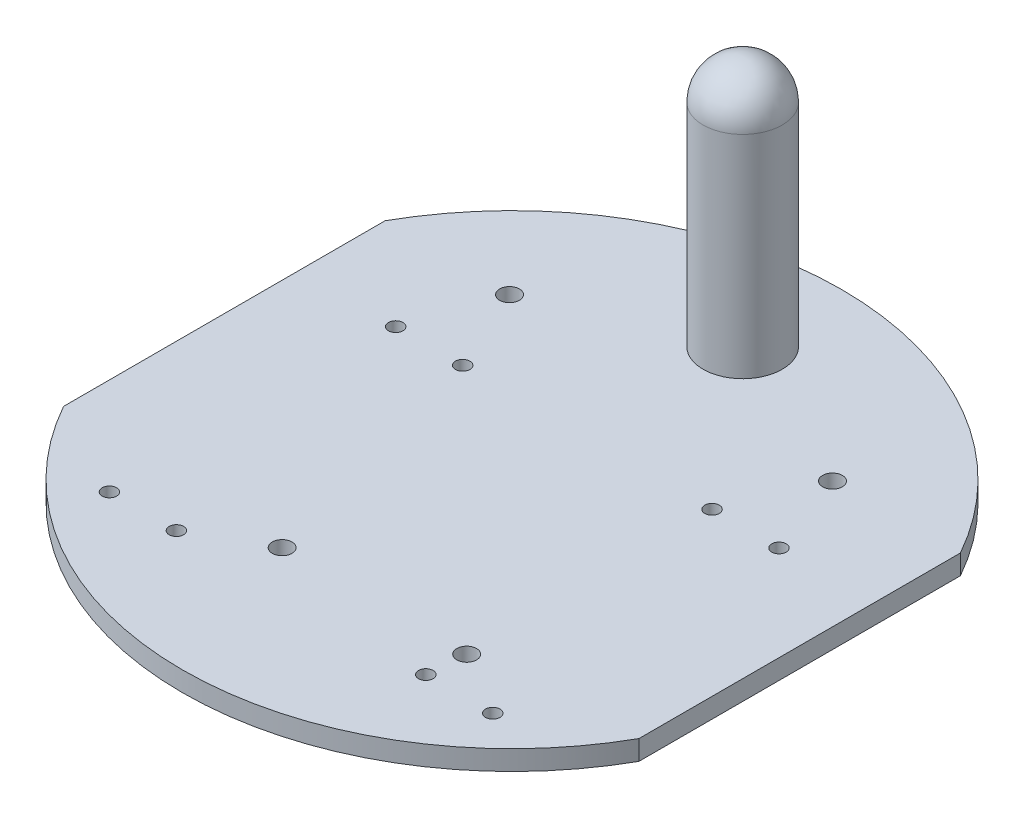
ISO-10303-21;
HEADER;
FILE_DESCRIPTION(('STEP AP214'),'2;1');
FILE_NAME('part.step','',(''),(''),'','','');
FILE_SCHEMA(('AUTOMOTIVE_DESIGN { 1 0 10303 214 1 1 1 1 }'));
ENDSEC;
DATA;
#1=APPLICATION_CONTEXT('core data for automotive mechanical design processes');
#2=APPLICATION_PROTOCOL_DEFINITION('international standard','automotive_design',2000,#1);
#3=PRODUCT_CONTEXT('',#1,'mechanical');
#4=PRODUCT('Part','Part','',(#3));
#5=PRODUCT_RELATED_PRODUCT_CATEGORY('part','',(#4));
#6=PRODUCT_DEFINITION_FORMATION('','',#4);
#7=PRODUCT_DEFINITION_CONTEXT('part definition',#1,'design');
#8=PRODUCT_DEFINITION('design','',#6,#7);
#9=PRODUCT_DEFINITION_SHAPE('','',#8);
#10=(LENGTH_UNIT() NAMED_UNIT(*) SI_UNIT(.MILLI.,.METRE.));
#11=(NAMED_UNIT(*) PLANE_ANGLE_UNIT() SI_UNIT($,.RADIAN.));
#12=(NAMED_UNIT(*) SI_UNIT($,.STERADIAN.) SOLID_ANGLE_UNIT());
#13=UNCERTAINTY_MEASURE_WITH_UNIT(LENGTH_MEASURE(1.E-05),#10,'distance_accuracy_value','');
#14=(GEOMETRIC_REPRESENTATION_CONTEXT(3) GLOBAL_UNCERTAINTY_ASSIGNED_CONTEXT((#13)) GLOBAL_UNIT_ASSIGNED_CONTEXT((#10,
#11,#12)) REPRESENTATION_CONTEXT('',''));
#15=CARTESIAN_POINT('',(0.,0.,0.));
#16=DIRECTION('',(0.,0.,1.));
#17=DIRECTION('',(1.,0.,0.));
#18=AXIS2_PLACEMENT_3D('',#15,#16,#17);
#19=CARTESIAN_POINT('',(0.,3.,0.));
#20=DIRECTION('',(0.,-1.,0.));
#21=DIRECTION('',(0.,0.,-1.));
#22=AXIS2_PLACEMENT_3D('',#19,#20,#21);
#23=CYLINDRICAL_SURFACE('',#22,50.);
#24=CARTESIAN_POINT('',(0.,0.,0.));
#25=DIRECTION('',(0.,1.,0.));
#26=DIRECTION('',(0.,0.,1.));
#27=AXIS2_PLACEMENT_3D('',#24,#25,#26);
#28=CIRCLE('',#27,50.);
#29=CARTESIAN_POINT('',(43.65,0.,-24.3860103337959));
#30=VERTEX_POINT('',#29);
#31=CARTESIAN_POINT('',(-43.65,0.,-24.3860103337959));
#32=VERTEX_POINT('',#31);
#33=EDGE_CURVE('E93',#30,#32,#28,.T.);
#34=ORIENTED_EDGE('',*,*,#33,.T.);
#35=DIRECTION('',(0.,1.,0.));
#36=VECTOR('',#35,1.);
#37=CARTESIAN_POINT('',(-43.65,-35.1,-24.3860103337959));
#38=LINE('',#37,#36);
#39=CARTESIAN_POINT('',(-43.65,3.,-24.3860103337959));
#40=VERTEX_POINT('',#39);
#41=EDGE_CURVE('E50',#32,#40,#38,.T.);
#42=ORIENTED_EDGE('',*,*,#41,.T.);
#43=CARTESIAN_POINT('',(0.,3.,0.));
#44=DIRECTION('',(0.,1.,0.));
#45=DIRECTION('',(0.,0.,1.));
#46=AXIS2_PLACEMENT_3D('',#43,#44,#45);
#47=CIRCLE('',#46,50.);
#48=CARTESIAN_POINT('',(43.65,3.,-24.3860103337959));
#49=VERTEX_POINT('',#48);
#50=EDGE_CURVE('E90',#49,#40,#47,.T.);
#51=ORIENTED_EDGE('',*,*,#50,.F.);
#52=DIRECTION('',(0.,1.,0.));
#53=VECTOR('',#52,1.);
#54=CARTESIAN_POINT('',(43.65,-35.1,-24.3860103337959));
#55=LINE('',#54,#53);
#56=EDGE_CURVE('E109',#30,#49,#55,.T.);
#57=ORIENTED_EDGE('',*,*,#56,.F.);
#58=EDGE_LOOP('',(#34,#42,#51,#57));
#59=FACE_BOUND('',#58,.T.);
#60=ADVANCED_FACE('F35',(#59),#23,.T.);
#61=CARTESIAN_POINT('',(-43.65,3.,24.3860103337959));
#62=VERTEX_POINT('',#61);
#63=CARTESIAN_POINT('',(43.65,3.,24.3860103337959));
#64=VERTEX_POINT('',#63);
#65=EDGE_CURVE('E88',#62,#64,#47,.T.);
#66=ORIENTED_EDGE('',*,*,#65,.F.);
#67=DIRECTION('',(0.,1.,0.));
#68=VECTOR('',#67,1.);
#69=CARTESIAN_POINT('',(-43.65,-35.1,24.3860103337959));
#70=LINE('',#69,#68);
#71=CARTESIAN_POINT('',(-43.65,0.,24.3860103337959));
#72=VERTEX_POINT('',#71);
#73=EDGE_CURVE('E73',#72,#62,#70,.T.);
#74=ORIENTED_EDGE('',*,*,#73,.F.);
#75=CARTESIAN_POINT('',(43.65,0.,24.3860103337959));
#76=VERTEX_POINT('',#75);
#77=EDGE_CURVE('E97',#72,#76,#28,.T.);
#78=ORIENTED_EDGE('',*,*,#77,.T.);
#79=DIRECTION('',(0.,1.,0.));
#80=VECTOR('',#79,1.);
#81=CARTESIAN_POINT('',(43.65,-35.1,24.3860103337959));
#82=LINE('',#81,#80);
#83=EDGE_CURVE('E57',#76,#64,#82,.T.);
#84=ORIENTED_EDGE('',*,*,#83,.T.);
#85=EDGE_LOOP('',(#66,#74,#78,#84));
#86=FACE_BOUND('',#85,.T.);
#87=ADVANCED_FACE('F92',(#86),#23,.T.);
#88=CARTESIAN_POINT('',(0.,3.,0.));
#89=DIRECTION('',(0.,1.,0.));
#90=DIRECTION('',(0.,0.,1.));
#91=AXIS2_PLACEMENT_3D('',#88,#89,#90);
#92=PLANE('',#91);
#93=CARTESIAN_POINT('',(-24.4999999999998,3.,-24.126010333796));
#94=DIRECTION('',(0.,1.,0.));
#95=DIRECTION('',(0.,0.,1.));
#96=AXIS2_PLACEMENT_3D('',#93,#94,#95);
#97=CIRCLE('',#96,1.5);
#98=CARTESIAN_POINT('',(-24.4999999999998,3.,-22.626010333796));
#99=VERTEX_POINT('',#98);
#100=EDGE_CURVE('E171',#99,#99,#97,.F.);
#101=ORIENTED_EDGE('',*,*,#100,.T.);
#102=EDGE_LOOP('',(#101));
#103=FACE_BOUND('',#102,.T.);
#104=CARTESIAN_POINT('',(24.5000000000002,3.,-24.1260103337965));
#105=DIRECTION('',(0.,1.,0.));
#106=DIRECTION('',(0.,0.,1.));
#107=AXIS2_PLACEMENT_3D('',#104,#105,#106);
#108=CIRCLE('',#107,1.5);
#109=CARTESIAN_POINT('',(24.5000000000002,3.,-22.6260103337965));
#110=VERTEX_POINT('',#109);
#111=EDGE_CURVE('E178',#110,#110,#108,.F.);
#112=ORIENTED_EDGE('',*,*,#111,.T.);
#113=EDGE_LOOP('',(#112));
#114=FACE_BOUND('',#113,.T.);
#115=CARTESIAN_POINT('',(-8.49999999999926,3.,26.3739896662038));
#116=DIRECTION('',(0.,1.,0.));
#117=DIRECTION('',(0.,0.,1.));
#118=AXIS2_PLACEMENT_3D('',#115,#116,#117);
#119=CIRCLE('',#118,1.50000000000001);
#120=CARTESIAN_POINT('',(-8.49999999999926,3.,27.8739896662038));
#121=VERTEX_POINT('',#120);
#122=EDGE_CURVE('E170',#121,#121,#119,.F.);
#123=ORIENTED_EDGE('',*,*,#122,.T.);
#124=EDGE_LOOP('',(#123));
#125=FACE_BOUND('',#124,.T.);
#126=CARTESIAN_POINT('',(19.5000000000007,3.,26.3739896662035));
#127=DIRECTION('',(0.,1.,0.));
#128=DIRECTION('',(0.,0.,1.));
#129=AXIS2_PLACEMENT_3D('',#126,#127,#128);
#130=CIRCLE('',#129,1.49999999999998);
#131=CARTESIAN_POINT('',(19.5000000000007,3.,27.8739896662035));
#132=VERTEX_POINT('',#131);
#133=EDGE_CURVE('E151',#132,#132,#130,.F.);
#134=ORIENTED_EDGE('',*,*,#133,.T.);
#135=EDGE_LOOP('',(#134));
#136=FACE_BOUND('',#135,.T.);
#137=CARTESIAN_POINT('',(-18.7700000000007,3.,-11.280989666204));
#138=DIRECTION('',(0.,1.,0.));
#139=DIRECTION('',(0.,0.,1.));
#140=AXIS2_PLACEMENT_3D('',#137,#138,#139);
#141=CIRCLE('',#140,1.1);
#142=CARTESIAN_POINT('',(-18.7700000000007,3.,-10.180989666204));
#143=VERTEX_POINT('',#142);
#144=EDGE_CURVE('E120',#143,#143,#141,.T.);
#145=ORIENTED_EDGE('',*,*,#144,.F.);
#146=EDGE_LOOP('',(#145));
#147=FACE_BOUND('',#146,.T.);
#148=CARTESIAN_POINT('',(19.0699999999996,3.,-11.280989666204));
#149=DIRECTION('',(0.,1.,0.));
#150=DIRECTION('',(0.,0.,1.));
#151=AXIS2_PLACEMENT_3D('',#148,#149,#150);
#152=CIRCLE('',#151,1.1);
#153=CARTESIAN_POINT('',(19.0699999999996,3.,-10.180989666204));
#154=VERTEX_POINT('',#153);
#155=EDGE_CURVE('E139',#154,#154,#152,.T.);
#156=ORIENTED_EDGE('',*,*,#155,.F.);
#157=EDGE_LOOP('',(#156));
#158=FACE_BOUND('',#157,.T.);
#159=CARTESIAN_POINT('',(29.2299999999993,3.,-11.2809896662044));
#160=DIRECTION('',(0.,1.,0.));
#161=DIRECTION('',(0.,0.,1.));
#162=AXIS2_PLACEMENT_3D('',#159,#160,#161);
#163=CIRCLE('',#162,1.1);
#164=CARTESIAN_POINT('',(29.2299999999993,3.,-10.1809896662044));
#165=VERTEX_POINT('',#164);
#166=EDGE_CURVE('E133',#165,#165,#163,.T.);
#167=ORIENTED_EDGE('',*,*,#166,.F.);
#168=EDGE_LOOP('',(#167));
#169=FACE_BOUND('',#168,.T.);
#170=CARTESIAN_POINT('',(29.2299999999993,3.,32.153010333796));
#171=DIRECTION('',(0.,1.,0.));
#172=DIRECTION('',(0.,0.,1.));
#173=AXIS2_PLACEMENT_3D('',#170,#171,#172);
#174=CIRCLE('',#173,1.1);
#175=CARTESIAN_POINT('',(29.2299999999993,3.,33.253010333796));
#176=VERTEX_POINT('',#175);
#177=EDGE_CURVE('E126',#176,#176,#174,.T.);
#178=ORIENTED_EDGE('',*,*,#177,.F.);
#179=EDGE_LOOP('',(#178));
#180=FACE_BOUND('',#179,.T.);
#181=CARTESIAN_POINT('',(19.0699999999996,3.,32.1530103337957));
#182=DIRECTION('',(0.,1.,0.));
#183=DIRECTION('',(0.,0.,1.));
#184=AXIS2_PLACEMENT_3D('',#181,#182,#183);
#185=CIRCLE('',#184,1.1);
#186=CARTESIAN_POINT('',(19.0699999999996,3.,33.2530103337957));
#187=VERTEX_POINT('',#186);
#188=EDGE_CURVE('E127',#187,#187,#185,.T.);
#189=ORIENTED_EDGE('',*,*,#188,.F.);
#190=EDGE_LOOP('',(#189));
#191=FACE_BOUND('',#190,.T.);
#192=CARTESIAN_POINT('',(-18.7700000000007,3.,32.1530103337957));
#193=DIRECTION('',(0.,1.,0.));
#194=DIRECTION('',(0.,0.,1.));
#195=AXIS2_PLACEMENT_3D('',#192,#193,#194);
#196=CIRCLE('',#195,1.1);
#197=CARTESIAN_POINT('',(-18.7700000000007,3.,33.2530103337957));
#198=VERTEX_POINT('',#197);
#199=EDGE_CURVE('E157',#198,#198,#196,.T.);
#200=ORIENTED_EDGE('',*,*,#199,.F.);
#201=EDGE_LOOP('',(#200));
#202=FACE_BOUND('',#201,.T.);
#203=CARTESIAN_POINT('',(-28.9300000000004,3.,32.153010333796));
#204=DIRECTION('',(0.,1.,0.));
#205=DIRECTION('',(0.,0.,1.));
#206=AXIS2_PLACEMENT_3D('',#203,#204,#205);
#207=CIRCLE('',#206,1.1);
#208=CARTESIAN_POINT('',(-28.9300000000004,3.,33.253010333796));
#209=VERTEX_POINT('',#208);
#210=EDGE_CURVE('E150',#209,#209,#207,.T.);
#211=ORIENTED_EDGE('',*,*,#210,.F.);
#212=EDGE_LOOP('',(#211));
#213=FACE_BOUND('',#212,.T.);
#214=CARTESIAN_POINT('',(-28.9300000000004,3.,-11.2809896662044));
#215=DIRECTION('',(0.,1.,0.));
#216=DIRECTION('',(0.,0.,1.));
#217=AXIS2_PLACEMENT_3D('',#214,#215,#216);
#218=CIRCLE('',#217,1.1);
#219=CARTESIAN_POINT('',(-28.9300000000004,3.,-10.1809896662044));
#220=VERTEX_POINT('',#219);
#221=EDGE_CURVE('E117',#220,#220,#218,.T.);
#222=ORIENTED_EDGE('',*,*,#221,.F.);
#223=EDGE_LOOP('',(#222));
#224=FACE_BOUND('',#223,.T.);
#225=DIRECTION('',(0.,0.,-1.));
#226=VECTOR('',#225,1.);
#227=CARTESIAN_POINT('',(-43.65,3.,-24.3860103337959));
#228=LINE('',#227,#226);
#229=EDGE_CURVE('E76',#62,#40,#228,.T.);
#230=ORIENTED_EDGE('',*,*,#229,.F.);
#231=ORIENTED_EDGE('',*,*,#65,.T.);
#232=DIRECTION('',(0.,0.,1.));
#233=VECTOR('',#232,1.);
#234=CARTESIAN_POINT('',(43.65,3.,-24.3860103337959));
#235=LINE('',#234,#233);
#236=EDGE_CURVE('E111',#49,#64,#235,.T.);
#237=ORIENTED_EDGE('',*,*,#236,.F.);
#238=ORIENTED_EDGE('',*,*,#50,.T.);
#239=EDGE_LOOP('',(#230,#231,#237,#238));
#240=FACE_BOUND('',#239,.T.);
#241=CARTESIAN_POINT('',(0.,3.,-35.));
#242=DIRECTION('',(0.,1.,0.));
#243=DIRECTION('',(0.,0.,1.));
#244=AXIS2_PLACEMENT_3D('',#241,#242,#243);
#245=CIRCLE('',#244,6.);
#246=CARTESIAN_POINT('',(0.,3.,-41.));
#247=VERTEX_POINT('',#246);
#248=EDGE_CURVE('E100',#247,#247,#245,.T.);
#249=ORIENTED_EDGE('',*,*,#248,.F.);
#250=EDGE_LOOP('',(#249));
#251=FACE_BOUND('',#250,.T.);
#252=ADVANCED_FACE('F85',(#103,#114,#125,#136,#147,#158,#169,#180,#191,#202,#213,#224,#240,
#251),#92,.T.);
#253=CARTESIAN_POINT('',(0.,0.,0.));
#254=DIRECTION('',(0.,1.,0.));
#255=DIRECTION('',(0.,0.,1.));
#256=AXIS2_PLACEMENT_3D('',#253,#254,#255);
#257=PLANE('',#256);
#258=CARTESIAN_POINT('',(-24.4999999999998,0.,-24.126010333796));
#259=DIRECTION('',(0.,-1.,0.));
#260=DIRECTION('',(0.,0.,-1.));
#261=AXIS2_PLACEMENT_3D('',#258,#259,#260);
#262=CIRCLE('',#261,1.5);
#263=CARTESIAN_POINT('',(-24.4999999999998,0.,-25.626010333796));
#264=VERTEX_POINT('',#263);
#265=EDGE_CURVE('E175',#264,#264,#262,.T.);
#266=ORIENTED_EDGE('',*,*,#265,.F.);
#267=EDGE_LOOP('',(#266));
#268=FACE_BOUND('',#267,.T.);
#269=CARTESIAN_POINT('',(24.5000000000002,0.,-24.1260103337965));
#270=DIRECTION('',(0.,-1.,0.));
#271=DIRECTION('',(0.,0.,-1.));
#272=AXIS2_PLACEMENT_3D('',#269,#270,#271);
#273=CIRCLE('',#272,1.5);
#274=CARTESIAN_POINT('',(24.5000000000002,0.,-25.6260103337965));
#275=VERTEX_POINT('',#274);
#276=EDGE_CURVE('E174',#275,#275,#273,.T.);
#277=ORIENTED_EDGE('',*,*,#276,.F.);
#278=EDGE_LOOP('',(#277));
#279=FACE_BOUND('',#278,.T.);
#280=CARTESIAN_POINT('',(-8.49999999999926,0.,26.3739896662038));
#281=DIRECTION('',(0.,-1.,0.));
#282=DIRECTION('',(0.,0.,-1.));
#283=AXIS2_PLACEMENT_3D('',#280,#281,#282);
#284=CIRCLE('',#283,1.50000000000001);
#285=CARTESIAN_POINT('',(-8.49999999999926,0.,24.8739896662038));
#286=VERTEX_POINT('',#285);
#287=EDGE_CURVE('E181',#286,#286,#284,.T.);
#288=ORIENTED_EDGE('',*,*,#287,.F.);
#289=EDGE_LOOP('',(#288));
#290=FACE_BOUND('',#289,.T.);
#291=CARTESIAN_POINT('',(19.5000000000007,0.,26.3739896662035));
#292=DIRECTION('',(0.,-1.,0.));
#293=DIRECTION('',(0.,0.,-1.));
#294=AXIS2_PLACEMENT_3D('',#291,#292,#293);
#295=CIRCLE('',#294,1.49999999999998);
#296=CARTESIAN_POINT('',(19.5000000000007,0.,24.8739896662035));
#297=VERTEX_POINT('',#296);
#298=EDGE_CURVE('E167',#297,#297,#295,.T.);
#299=ORIENTED_EDGE('',*,*,#298,.F.);
#300=EDGE_LOOP('',(#299));
#301=FACE_BOUND('',#300,.T.);
#302=ORIENTED_EDGE('',*,*,#77,.F.);
#303=DIRECTION('',(0.,0.,-1.));
#304=VECTOR('',#303,1.);
#305=CARTESIAN_POINT('',(-43.65,0.,0.));
#306=LINE('',#305,#304);
#307=EDGE_CURVE('E11',#72,#32,#306,.T.);
#308=ORIENTED_EDGE('',*,*,#307,.T.);
#309=ORIENTED_EDGE('',*,*,#33,.F.);
#310=DIRECTION('',(0.,0.,1.));
#311=VECTOR('',#310,1.);
#312=CARTESIAN_POINT('',(43.65,0.,0.));
#313=LINE('',#312,#311);
#314=EDGE_CURVE('E43',#30,#76,#313,.T.);
#315=ORIENTED_EDGE('',*,*,#314,.T.);
#316=EDGE_LOOP('',(#302,#308,#309,#315));
#317=FACE_BOUND('',#316,.T.);
#318=ADVANCED_FACE('F106',(#268,#279,#290,#301,#317),#257,.F.);
#319=CARTESIAN_POINT('',(0.,41.1,-35.));
#320=DIRECTION('',(0.,-1.,0.));
#321=DIRECTION('',(0.,0.,-1.));
#322=AXIS2_PLACEMENT_3D('',#319,#320,#321);
#323=CYLINDRICAL_SURFACE('',#322,6.);
#324=CARTESIAN_POINT('',(0.,35.1,-35.));
#325=DIRECTION('',(0.,-1.,0.));
#326=DIRECTION('',(0.,0.,-1.));
#327=AXIS2_PLACEMENT_3D('',#324,#325,#326);
#328=CIRCLE('',#327,6.);
#329=CARTESIAN_POINT('',(0.,35.1,-41.));
#330=VERTEX_POINT('',#329);
#331=EDGE_CURVE('E95',#330,#330,#328,.T.);
#332=CARTESIAN_POINT('',(0.,35.1,-41.));
#333=CARTESIAN_POINT('',(0.,34.765625,-41.));
#334=CARTESIAN_POINT('',(0.,34.43125,-41.));
#335=CARTESIAN_POINT('',(0.,33.7625,-41.));
#336=CARTESIAN_POINT('',(0.,33.428125,-41.));
#337=CARTESIAN_POINT('',(0.,32.759375,-41.));
#338=CARTESIAN_POINT('',(0.,32.425,-41.));
#339=CARTESIAN_POINT('',(0.,31.75625,-41.));
#340=CARTESIAN_POINT('',(0.,31.421875,-41.));
#341=CARTESIAN_POINT('',(0.,30.753125,-41.));
#342=CARTESIAN_POINT('',(0.,30.41875,-41.));
#343=CARTESIAN_POINT('',(0.,29.75,-41.));
#344=CARTESIAN_POINT('',(0.,29.415625,-41.));
#345=CARTESIAN_POINT('',(0.,28.746875,-41.));
#346=CARTESIAN_POINT('',(0.,28.4125,-41.));
#347=CARTESIAN_POINT('',(0.,27.74375,-41.));
#348=CARTESIAN_POINT('',(0.,27.409375,-41.));
#349=CARTESIAN_POINT('',(0.,26.740625,-41.));
#350=CARTESIAN_POINT('',(0.,26.40625,-41.));
#351=CARTESIAN_POINT('',(0.,25.7375,-41.));
#352=CARTESIAN_POINT('',(0.,25.403125,-41.));
#353=CARTESIAN_POINT('',(0.,24.734375,-41.));
#354=CARTESIAN_POINT('',(0.,24.4,-41.));
#355=CARTESIAN_POINT('',(0.,23.73125,-41.));
#356=CARTESIAN_POINT('',(0.,23.396875,-41.));
#357=CARTESIAN_POINT('',(0.,22.728125,-41.));
#358=CARTESIAN_POINT('',(0.,22.39375,-41.));
#359=CARTESIAN_POINT('',(0.,21.725,-41.));
#360=CARTESIAN_POINT('',(0.,21.390625,-41.));
#361=CARTESIAN_POINT('',(0.,20.721875,-41.));
#362=CARTESIAN_POINT('',(0.,20.3875,-41.));
#363=CARTESIAN_POINT('',(0.,19.71875,-41.));
#364=CARTESIAN_POINT('',(0.,19.384375,-41.));
#365=CARTESIAN_POINT('',(0.,18.715625,-41.));
#366=CARTESIAN_POINT('',(0.,18.38125,-41.));
#367=CARTESIAN_POINT('',(0.,17.7125,-41.));
#368=CARTESIAN_POINT('',(0.,17.378125,-41.));
#369=CARTESIAN_POINT('',(0.,16.709375,-41.));
#370=CARTESIAN_POINT('',(0.,16.375,-41.));
#371=CARTESIAN_POINT('',(0.,15.70625,-41.));
#372=CARTESIAN_POINT('',(0.,15.371875,-41.));
#373=CARTESIAN_POINT('',(0.,14.703125,-41.));
#374=CARTESIAN_POINT('',(0.,14.36875,-41.));
#375=CARTESIAN_POINT('',(0.,13.7,-41.));
#376=CARTESIAN_POINT('',(0.,13.365625,-41.));
#377=CARTESIAN_POINT('',(0.,12.696875,-41.));
#378=CARTESIAN_POINT('',(0.,12.3625,-41.));
#379=CARTESIAN_POINT('',(0.,11.69375,-41.));
#380=CARTESIAN_POINT('',(0.,11.359375,-41.));
#381=CARTESIAN_POINT('',(0.,10.690625,-41.));
#382=CARTESIAN_POINT('',(0.,10.35625,-41.));
#383=CARTESIAN_POINT('',(0.,9.6875,-41.));
#384=CARTESIAN_POINT('',(0.,9.353125,-41.));
#385=CARTESIAN_POINT('',(0.,8.684375,-41.));
#386=CARTESIAN_POINT('',(0.,8.35,-41.));
#387=CARTESIAN_POINT('',(0.,7.68125,-41.));
#388=CARTESIAN_POINT('',(0.,7.346875,-41.));
#389=CARTESIAN_POINT('',(0.,6.678125,-41.));
#390=CARTESIAN_POINT('',(0.,6.34375,-41.));
#391=CARTESIAN_POINT('',(0.,5.675,-41.));
#392=CARTESIAN_POINT('',(0.,5.340625,-41.));
#393=CARTESIAN_POINT('',(0.,4.671875,-41.));
#394=CARTESIAN_POINT('',(0.,4.3375,-41.));
#395=CARTESIAN_POINT('',(0.,3.66875,-41.));
#396=CARTESIAN_POINT('',(0.,3.334375,-41.));
#397=CARTESIAN_POINT('',(0.,3.,-41.));
#398=B_SPLINE_CURVE_WITH_KNOTS('',3,(#332,#333,#334,#335,#336,#337,#338,#339,#340,#341,#342,
#343,#344,#345,#346,#347,#348,#349,#350,#351,#352,#353,#354,#355,#356,#357,#358,#359,#360,#361,
#362,#363,#364,#365,#366,#367,#368,#369,#370,#371,#372,#373,#374,#375,#376,#377,#378,#379,#380,
#381,#382,#383,#384,#385,#386,#387,#388,#389,#390,#391,#392,#393,#394,#395,#396,#397),
.UNSPECIFIED.,.F.,.F.,(4,2,2,2,2,2,2,2,2,2,2,2,2,2,2,2,2,2,2,2,2,2,2,2,2,2,2,2,2,2,2,2,4),(0.,
1.003125,2.00625,3.009375,4.0125,5.015625,6.01875,7.021875,8.025,9.028125,10.03125,11.034375,
12.0375,13.040625,14.04375,15.046875,16.05,17.053125,18.05625,19.059375,20.0625,21.065625,
22.06875,23.071875,24.075,25.078125,26.08125,27.084375,28.0875,29.090625,30.09375,31.096875,
32.1),.UNSPECIFIED.);
#399=EDGE_CURVE('BSEAM194',#330,#247,#398,.T.);
#400=ORIENTED_EDGE('',*,*,#331,.T.);
#401=ORIENTED_EDGE('',*,*,#248,.T.);
#402=ORIENTED_EDGE('',*,*,#399,.T.);
#403=ORIENTED_EDGE('',*,*,#399,.F.);
#404=EDGE_LOOP('',(#400,#402,#401,#403));
#405=FACE_BOUND('',#404,.T.);
#406=ADVANCED_FACE('F194',(#405),#323,.T.);
#407=CARTESIAN_POINT('',(0.,35.1,-35.));
#408=DIRECTION('',(0.,1.,0.));
#409=DIRECTION('',(0.,0.,1.));
#410=AXIS2_PLACEMENT_3D('',#407,#408,#409);
#411=SPHERICAL_SURFACE('',#410,6.);
#412=ORIENTED_EDGE('',*,*,#331,.F.);
#413=EDGE_LOOP('',(#412));
#414=FACE_BOUND('',#413,.T.);
#415=ADVANCED_FACE('F37',(#414),#411,.T.);
#416=CARTESIAN_POINT('',(43.65,-35.1,-24.3860103337959));
#417=DIRECTION('',(-1.,0.,0.));
#418=DIRECTION('',(0.,0.,1.));
#419=AXIS2_PLACEMENT_3D('',#416,#417,#418);
#420=PLANE('',#419);
#421=ORIENTED_EDGE('',*,*,#56,.T.);
#422=ORIENTED_EDGE('',*,*,#236,.T.);
#423=ORIENTED_EDGE('',*,*,#83,.F.);
#424=ORIENTED_EDGE('',*,*,#314,.F.);
#425=EDGE_LOOP('',(#421,#422,#423,#424));
#426=FACE_BOUND('',#425,.T.);
#427=ADVANCED_FACE('F108',(#426),#420,.F.);
#428=CARTESIAN_POINT('',(-43.65,-35.1,-24.3860103337959));
#429=DIRECTION('',(1.,0.,0.));
#430=DIRECTION('',(0.,0.,-1.));
#431=AXIS2_PLACEMENT_3D('',#428,#429,#430);
#432=PLANE('',#431);
#433=ORIENTED_EDGE('',*,*,#73,.T.);
#434=ORIENTED_EDGE('',*,*,#229,.T.);
#435=ORIENTED_EDGE('',*,*,#41,.F.);
#436=ORIENTED_EDGE('',*,*,#307,.F.);
#437=EDGE_LOOP('',(#433,#434,#435,#436));
#438=FACE_BOUND('',#437,.T.);
#439=ADVANCED_FACE('F75',(#438),#432,.F.);
#440=CARTESIAN_POINT('',(-28.9300000000004,0.8,-11.2809896662044));
#441=DIRECTION('',(0.,1.,0.));
#442=DIRECTION('',(0.,0.,1.));
#443=AXIS2_PLACEMENT_3D('',#440,#441,#442);
#444=CYLINDRICAL_SURFACE('',#443,1.1);
#445=CARTESIAN_POINT('',(-28.9300000000004,0.8,-11.2809896662044));
#446=DIRECTION('',(0.,1.,0.));
#447=DIRECTION('',(0.,0.,1.));
#448=AXIS2_PLACEMENT_3D('',#445,#446,#447);
#449=CIRCLE('',#448,1.1);
#450=CARTESIAN_POINT('',(-28.9300000000004,0.8,-10.1809896662044));
#451=VERTEX_POINT('',#450);
#452=EDGE_CURVE('E113',#451,#451,#449,.T.);
#453=ORIENTED_EDGE('',*,*,#452,.F.);
#454=EDGE_LOOP('',(#453));
#455=FACE_BOUND('',#454,.T.);
#456=ORIENTED_EDGE('',*,*,#221,.T.);
#457=EDGE_LOOP('',(#456));
#458=FACE_BOUND('',#457,.T.);
#459=ADVANCED_FACE('F226',(#455,#458),#444,.F.);
#460=CARTESIAN_POINT('',(-28.9300000000004,0.8,-11.2809896662044));
#461=DIRECTION('',(0.,1.,0.));
#462=DIRECTION('',(0.,0.,1.));
#463=AXIS2_PLACEMENT_3D('',#460,#461,#462);
#464=PLANE('',#463);
#465=ORIENTED_EDGE('',*,*,#452,.T.);
#466=EDGE_LOOP('',(#465));
#467=FACE_BOUND('',#466,.T.);
#468=ADVANCED_FACE('F228',(#467),#464,.T.);
#469=CARTESIAN_POINT('',(-28.9300000000004,0.8,32.153010333796));
#470=DIRECTION('',(0.,1.,0.));
#471=DIRECTION('',(0.,0.,1.));
#472=AXIS2_PLACEMENT_3D('',#469,#470,#471);
#473=CYLINDRICAL_SURFACE('',#472,1.1);
#474=CARTESIAN_POINT('',(-28.9300000000004,0.8,32.153010333796));
#475=DIRECTION('',(0.,1.,0.));
#476=DIRECTION('',(0.,0.,1.));
#477=AXIS2_PLACEMENT_3D('',#474,#475,#476);
#478=CIRCLE('',#477,1.1);
#479=CARTESIAN_POINT('',(-28.9300000000004,0.8,33.253010333796));
#480=VERTEX_POINT('',#479);
#481=EDGE_CURVE('E147',#480,#480,#478,.T.);
#482=ORIENTED_EDGE('',*,*,#481,.F.);
#483=EDGE_LOOP('',(#482));
#484=FACE_BOUND('',#483,.T.);
#485=ORIENTED_EDGE('',*,*,#210,.T.);
#486=EDGE_LOOP('',(#485));
#487=FACE_BOUND('',#486,.T.);
#488=ADVANCED_FACE('F235',(#484,#487),#473,.F.);
#489=CARTESIAN_POINT('',(-28.9300000000004,0.8,32.153010333796));
#490=DIRECTION('',(0.,1.,0.));
#491=DIRECTION('',(0.,0.,1.));
#492=AXIS2_PLACEMENT_3D('',#489,#490,#491);
#493=PLANE('',#492);
#494=ORIENTED_EDGE('',*,*,#481,.T.);
#495=EDGE_LOOP('',(#494));
#496=FACE_BOUND('',#495,.T.);
#497=ADVANCED_FACE('F312',(#496),#493,.T.);
#498=CARTESIAN_POINT('',(-18.7700000000007,0.8,32.1530103337957));
#499=DIRECTION('',(0.,1.,0.));
#500=DIRECTION('',(0.,0.,1.));
#501=AXIS2_PLACEMENT_3D('',#498,#499,#500);
#502=CYLINDRICAL_SURFACE('',#501,1.1);
#503=CARTESIAN_POINT('',(-18.7700000000007,0.8,32.1530103337957));
#504=DIRECTION('',(0.,1.,0.));
#505=DIRECTION('',(0.,0.,1.));
#506=AXIS2_PLACEMENT_3D('',#503,#504,#505);
#507=CIRCLE('',#506,1.1);
#508=CARTESIAN_POINT('',(-18.7700000000007,0.8,33.2530103337957));
#509=VERTEX_POINT('',#508);
#510=EDGE_CURVE('E154',#509,#509,#507,.T.);
#511=ORIENTED_EDGE('',*,*,#510,.F.);
#512=EDGE_LOOP('',(#511));
#513=FACE_BOUND('',#512,.T.);
#514=ORIENTED_EDGE('',*,*,#199,.T.);
#515=EDGE_LOOP('',(#514));
#516=FACE_BOUND('',#515,.T.);
#517=ADVANCED_FACE('F322',(#513,#516),#502,.F.);
#518=CARTESIAN_POINT('',(-18.7700000000007,0.8,32.1530103337957));
#519=DIRECTION('',(0.,1.,0.));
#520=DIRECTION('',(0.,0.,1.));
#521=AXIS2_PLACEMENT_3D('',#518,#519,#520);
#522=PLANE('',#521);
#523=ORIENTED_EDGE('',*,*,#510,.T.);
#524=EDGE_LOOP('',(#523));
#525=FACE_BOUND('',#524,.T.);
#526=ADVANCED_FACE('F332',(#525),#522,.T.);
#527=CARTESIAN_POINT('',(19.0699999999996,0.8,32.1530103337957));
#528=DIRECTION('',(0.,1.,0.));
#529=DIRECTION('',(0.,0.,1.));
#530=AXIS2_PLACEMENT_3D('',#527,#528,#529);
#531=CYLINDRICAL_SURFACE('',#530,1.1);
#532=CARTESIAN_POINT('',(19.0699999999996,0.8,32.1530103337957));
#533=DIRECTION('',(0.,1.,0.));
#534=DIRECTION('',(0.,0.,1.));
#535=AXIS2_PLACEMENT_3D('',#532,#533,#534);
#536=CIRCLE('',#535,1.1);
#537=CARTESIAN_POINT('',(19.0699999999996,0.8,33.2530103337957));
#538=VERTEX_POINT('',#537);
#539=EDGE_CURVE('E160',#538,#538,#536,.T.);
#540=ORIENTED_EDGE('',*,*,#539,.F.);
#541=EDGE_LOOP('',(#540));
#542=FACE_BOUND('',#541,.T.);
#543=ORIENTED_EDGE('',*,*,#188,.T.);
#544=EDGE_LOOP('',(#543));
#545=FACE_BOUND('',#544,.T.);
#546=ADVANCED_FACE('F342',(#542,#545),#531,.F.);
#547=CARTESIAN_POINT('',(19.0699999999996,0.8,32.1530103337957));
#548=DIRECTION('',(0.,1.,0.));
#549=DIRECTION('',(0.,0.,1.));
#550=AXIS2_PLACEMENT_3D('',#547,#548,#549);
#551=PLANE('',#550);
#552=ORIENTED_EDGE('',*,*,#539,.T.);
#553=EDGE_LOOP('',(#552));
#554=FACE_BOUND('',#553,.T.);
#555=ADVANCED_FACE('F352',(#554),#551,.T.);
#556=CARTESIAN_POINT('',(29.2299999999993,0.8,32.153010333796));
#557=DIRECTION('',(0.,1.,0.));
#558=DIRECTION('',(0.,0.,1.));
#559=AXIS2_PLACEMENT_3D('',#556,#557,#558);
#560=CYLINDRICAL_SURFACE('',#559,1.1);
#561=CARTESIAN_POINT('',(29.2299999999993,0.8,32.153010333796));
#562=DIRECTION('',(0.,1.,0.));
#563=DIRECTION('',(0.,0.,1.));
#564=AXIS2_PLACEMENT_3D('',#561,#562,#563);
#565=CIRCLE('',#564,1.1);
#566=CARTESIAN_POINT('',(29.2299999999993,0.8,33.253010333796));
#567=VERTEX_POINT('',#566);
#568=EDGE_CURVE('E123',#567,#567,#565,.T.);
#569=ORIENTED_EDGE('',*,*,#568,.F.);
#570=EDGE_LOOP('',(#569));
#571=FACE_BOUND('',#570,.T.);
#572=ORIENTED_EDGE('',*,*,#177,.T.);
#573=EDGE_LOOP('',(#572));
#574=FACE_BOUND('',#573,.T.);
#575=ADVANCED_FACE('F362',(#571,#574),#560,.F.);
#576=CARTESIAN_POINT('',(29.2299999999993,0.8,32.153010333796));
#577=DIRECTION('',(0.,1.,0.));
#578=DIRECTION('',(0.,0.,1.));
#579=AXIS2_PLACEMENT_3D('',#576,#577,#578);
#580=PLANE('',#579);
#581=ORIENTED_EDGE('',*,*,#568,.T.);
#582=EDGE_LOOP('',(#581));
#583=FACE_BOUND('',#582,.T.);
#584=ADVANCED_FACE('F372',(#583),#580,.T.);
#585=CARTESIAN_POINT('',(29.2299999999993,0.8,-11.2809896662044));
#586=DIRECTION('',(0.,1.,0.));
#587=DIRECTION('',(0.,0.,1.));
#588=AXIS2_PLACEMENT_3D('',#585,#586,#587);
#589=CYLINDRICAL_SURFACE('',#588,1.1);
#590=CARTESIAN_POINT('',(29.2299999999993,0.8,-11.2809896662044));
#591=DIRECTION('',(0.,1.,0.));
#592=DIRECTION('',(0.,0.,1.));
#593=AXIS2_PLACEMENT_3D('',#590,#591,#592);
#594=CIRCLE('',#593,1.1);
#595=CARTESIAN_POINT('',(29.2299999999993,0.8,-10.1809896662044));
#596=VERTEX_POINT('',#595);
#597=EDGE_CURVE('E130',#596,#596,#594,.T.);
#598=ORIENTED_EDGE('',*,*,#597,.F.);
#599=EDGE_LOOP('',(#598));
#600=FACE_BOUND('',#599,.T.);
#601=ORIENTED_EDGE('',*,*,#166,.T.);
#602=EDGE_LOOP('',(#601));
#603=FACE_BOUND('',#602,.T.);
#604=ADVANCED_FACE('F382',(#600,#603),#589,.F.);
#605=CARTESIAN_POINT('',(29.2299999999993,0.8,-11.2809896662044));
#606=DIRECTION('',(0.,1.,0.));
#607=DIRECTION('',(0.,0.,1.));
#608=AXIS2_PLACEMENT_3D('',#605,#606,#607);
#609=PLANE('',#608);
#610=ORIENTED_EDGE('',*,*,#597,.T.);
#611=EDGE_LOOP('',(#610));
#612=FACE_BOUND('',#611,.T.);
#613=ADVANCED_FACE('F392',(#612),#609,.T.);
#614=CARTESIAN_POINT('',(19.0699999999996,0.8,-11.280989666204));
#615=DIRECTION('',(0.,1.,0.));
#616=DIRECTION('',(0.,0.,1.));
#617=AXIS2_PLACEMENT_3D('',#614,#615,#616);
#618=CYLINDRICAL_SURFACE('',#617,1.1);
#619=CARTESIAN_POINT('',(19.0699999999996,0.8,-11.280989666204));
#620=DIRECTION('',(0.,1.,0.));
#621=DIRECTION('',(0.,0.,1.));
#622=AXIS2_PLACEMENT_3D('',#619,#620,#621);
#623=CIRCLE('',#622,1.1);
#624=CARTESIAN_POINT('',(19.0699999999996,0.8,-10.180989666204));
#625=VERTEX_POINT('',#624);
#626=EDGE_CURVE('E136',#625,#625,#623,.T.);
#627=ORIENTED_EDGE('',*,*,#626,.F.);
#628=EDGE_LOOP('',(#627));
#629=FACE_BOUND('',#628,.T.);
#630=ORIENTED_EDGE('',*,*,#155,.T.);
#631=EDGE_LOOP('',(#630));
#632=FACE_BOUND('',#631,.T.);
#633=ADVANCED_FACE('F402',(#629,#632),#618,.F.);
#634=CARTESIAN_POINT('',(19.0699999999996,0.8,-11.280989666204));
#635=DIRECTION('',(0.,1.,0.));
#636=DIRECTION('',(0.,0.,1.));
#637=AXIS2_PLACEMENT_3D('',#634,#635,#636);
#638=PLANE('',#637);
#639=ORIENTED_EDGE('',*,*,#626,.T.);
#640=EDGE_LOOP('',(#639));
#641=FACE_BOUND('',#640,.T.);
#642=ADVANCED_FACE('F412',(#641),#638,.T.);
#643=CARTESIAN_POINT('',(-18.7700000000007,0.8,-11.280989666204));
#644=DIRECTION('',(0.,1.,0.));
#645=DIRECTION('',(0.,0.,1.));
#646=AXIS2_PLACEMENT_3D('',#643,#644,#645);
#647=CYLINDRICAL_SURFACE('',#646,1.1);
#648=CARTESIAN_POINT('',(-18.7700000000007,0.8,-11.280989666204));
#649=DIRECTION('',(0.,1.,0.));
#650=DIRECTION('',(0.,0.,1.));
#651=AXIS2_PLACEMENT_3D('',#648,#649,#650);
#652=CIRCLE('',#651,1.1);
#653=CARTESIAN_POINT('',(-18.7700000000007,0.8,-10.180989666204));
#654=VERTEX_POINT('',#653);
#655=EDGE_CURVE('E142',#654,#654,#652,.T.);
#656=ORIENTED_EDGE('',*,*,#655,.F.);
#657=EDGE_LOOP('',(#656));
#658=FACE_BOUND('',#657,.T.);
#659=ORIENTED_EDGE('',*,*,#144,.T.);
#660=EDGE_LOOP('',(#659));
#661=FACE_BOUND('',#660,.T.);
#662=ADVANCED_FACE('F422',(#658,#661),#647,.F.);
#663=CARTESIAN_POINT('',(-18.7700000000007,0.8,-11.280989666204));
#664=DIRECTION('',(0.,1.,0.));
#665=DIRECTION('',(0.,0.,1.));
#666=AXIS2_PLACEMENT_3D('',#663,#664,#665);
#667=PLANE('',#666);
#668=ORIENTED_EDGE('',*,*,#655,.T.);
#669=EDGE_LOOP('',(#668));
#670=FACE_BOUND('',#669,.T.);
#671=ADVANCED_FACE('F202',(#670),#667,.T.);
#672=CARTESIAN_POINT('',(19.5000000000007,7.24264068711931,26.3739896662035));
#673=DIRECTION('',(0.,-1.,0.));
#674=DIRECTION('',(0.,0.,-1.));
#675=AXIS2_PLACEMENT_3D('',#672,#673,#674);
#676=CYLINDRICAL_SURFACE('',#675,1.49999999999998);
#677=ORIENTED_EDGE('',*,*,#298,.T.);
#678=EDGE_LOOP('',(#677));
#679=FACE_BOUND('',#678,.T.);
#680=ORIENTED_EDGE('',*,*,#133,.F.);
#681=EDGE_LOOP('',(#680));
#682=FACE_BOUND('',#681,.T.);
#683=ADVANCED_FACE('F199',(#679,#682),#676,.F.);
#684=CARTESIAN_POINT('',(-8.49999999999926,7.24264068711931,26.3739896662038));
#685=DIRECTION('',(0.,-1.,0.));
#686=DIRECTION('',(0.,0.,-1.));
#687=AXIS2_PLACEMENT_3D('',#684,#685,#686);
#688=CYLINDRICAL_SURFACE('',#687,1.50000000000001);
#689=ORIENTED_EDGE('',*,*,#287,.T.);
#690=EDGE_LOOP('',(#689));
#691=FACE_BOUND('',#690,.T.);
#692=ORIENTED_EDGE('',*,*,#122,.F.);
#693=EDGE_LOOP('',(#692));
#694=FACE_BOUND('',#693,.T.);
#695=ADVANCED_FACE('F189',(#691,#694),#688,.F.);
#696=CARTESIAN_POINT('',(24.5000000000002,7.24264068711931,-24.1260103337965));
#697=DIRECTION('',(0.,-1.,0.));
#698=DIRECTION('',(0.,0.,-1.));
#699=AXIS2_PLACEMENT_3D('',#696,#697,#698);
#700=CYLINDRICAL_SURFACE('',#699,1.5);
#701=ORIENTED_EDGE('',*,*,#276,.T.);
#702=EDGE_LOOP('',(#701));
#703=FACE_BOUND('',#702,.T.);
#704=ORIENTED_EDGE('',*,*,#111,.F.);
#705=EDGE_LOOP('',(#704));
#706=FACE_BOUND('',#705,.T.);
#707=ADVANCED_FACE('F451',(#703,#706),#700,.F.);
#708=CARTESIAN_POINT('',(-24.4999999999998,7.24264068711931,-24.126010333796));
#709=DIRECTION('',(0.,-1.,0.));
#710=DIRECTION('',(0.,0.,-1.));
#711=AXIS2_PLACEMENT_3D('',#708,#709,#710);
#712=CYLINDRICAL_SURFACE('',#711,1.5);
#713=ORIENTED_EDGE('',*,*,#265,.T.);
#714=EDGE_LOOP('',(#713));
#715=FACE_BOUND('',#714,.T.);
#716=ORIENTED_EDGE('',*,*,#100,.F.);
#717=EDGE_LOOP('',(#716));
#718=FACE_BOUND('',#717,.T.);
#719=ADVANCED_FACE('F458',(#715,#718),#712,.F.);
#720=CLOSED_SHELL('',(#60,#87,#252,#318,#406,#415,#427,#439,#459,#468,#488,#497,#517,#526,#546,
#555,#575,#584,#604,#613,#633,#642,#662,#671,#683,#695,#707,#719));
#721=MANIFOLD_SOLID_BREP('B2',#720);
#722=ADVANCED_BREP_SHAPE_REPRESENTATION('',(#18,#721),#14);
#723=SHAPE_DEFINITION_REPRESENTATION(#9,#722);
ENDSEC;
END-ISO-10303-21;
